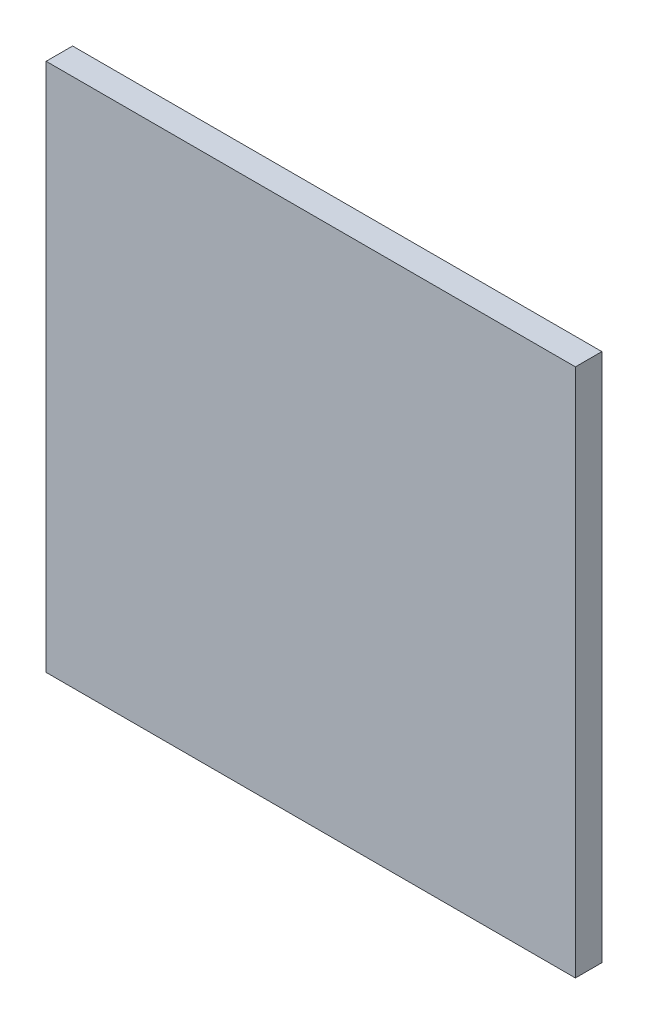
ISO-10303-21;
HEADER;
FILE_DESCRIPTION(('STEP AP214'),'2;1');
FILE_NAME('part.step','',(''),(''),'','','');
FILE_SCHEMA(('AUTOMOTIVE_DESIGN { 1 0 10303 214 1 1 1 1 }'));
ENDSEC;
DATA;
#1=APPLICATION_CONTEXT('core data for automotive mechanical design processes');
#2=APPLICATION_PROTOCOL_DEFINITION('international standard','automotive_design',2000,#1);
#3=PRODUCT_CONTEXT('',#1,'mechanical');
#4=PRODUCT('Part','Part','',(#3));
#5=PRODUCT_RELATED_PRODUCT_CATEGORY('part','',(#4));
#6=PRODUCT_DEFINITION_FORMATION('','',#4);
#7=PRODUCT_DEFINITION_CONTEXT('part definition',#1,'design');
#8=PRODUCT_DEFINITION('design','',#6,#7);
#9=PRODUCT_DEFINITION_SHAPE('','',#8);
#10=(LENGTH_UNIT() NAMED_UNIT(*) SI_UNIT(.MILLI.,.METRE.));
#11=(NAMED_UNIT(*) PLANE_ANGLE_UNIT() SI_UNIT($,.RADIAN.));
#12=(NAMED_UNIT(*) SI_UNIT($,.STERADIAN.) SOLID_ANGLE_UNIT());
#13=UNCERTAINTY_MEASURE_WITH_UNIT(LENGTH_MEASURE(1.E-05),#10,'distance_accuracy_value','');
#14=(GEOMETRIC_REPRESENTATION_CONTEXT(3) GLOBAL_UNCERTAINTY_ASSIGNED_CONTEXT((#13)) GLOBAL_UNIT_ASSIGNED_CONTEXT((#10,
#11,#12)) REPRESENTATION_CONTEXT('',''));
#15=CARTESIAN_POINT('',(0.,0.,0.));
#16=DIRECTION('',(0.,0.,1.));
#17=DIRECTION('',(1.,0.,0.));
#18=AXIS2_PLACEMENT_3D('',#15,#16,#17);
#19=CARTESIAN_POINT('',(0.,0.,3.));
#20=DIRECTION('',(-1.,0.,0.));
#21=DIRECTION('',(0.,0.,1.));
#22=AXIS2_PLACEMENT_3D('',#19,#20,#21);
#23=PLANE('',#22);
#24=DIRECTION('',(0.,1.,0.));
#25=VECTOR('',#24,1.);
#26=CARTESIAN_POINT('',(0.,0.,0.));
#27=LINE('',#26,#25);
#28=CARTESIAN_POINT('',(0.,0.,0.));
#29=VERTEX_POINT('',#28);
#30=CARTESIAN_POINT('',(0.,60.,0.));
#31=VERTEX_POINT('',#30);
#32=EDGE_CURVE('E109',#29,#31,#27,.T.);
#33=ORIENTED_EDGE('',*,*,#32,.T.);
#34=DIRECTION('',(0.,0.,-1.));
#35=VECTOR('',#34,1.);
#36=CARTESIAN_POINT('',(0.,60.,3.));
#37=LINE('',#36,#35);
#38=CARTESIAN_POINT('',(0.,60.,3.));
#39=VERTEX_POINT('',#38);
#40=EDGE_CURVE('E11',#39,#31,#37,.T.);
#41=ORIENTED_EDGE('',*,*,#40,.F.);
#42=DIRECTION('',(0.,1.,0.));
#43=VECTOR('',#42,1.);
#44=CARTESIAN_POINT('',(0.,0.,3.));
#45=LINE('',#44,#43);
#46=CARTESIAN_POINT('',(0.,0.,3.));
#47=VERTEX_POINT('',#46);
#48=EDGE_CURVE('E93',#47,#39,#45,.T.);
#49=ORIENTED_EDGE('',*,*,#48,.F.);
#50=DIRECTION('',(0.,0.,-1.));
#51=VECTOR('',#50,1.);
#52=CARTESIAN_POINT('',(0.,0.,3.));
#53=LINE('',#52,#51);
#54=EDGE_CURVE('E105',#47,#29,#53,.T.);
#55=ORIENTED_EDGE('',*,*,#54,.T.);
#56=EDGE_LOOP('',(#33,#41,#49,#55));
#57=FACE_BOUND('',#56,.T.);
#58=ADVANCED_FACE('F41',(#57),#23,.F.);
#59=CARTESIAN_POINT('',(0.,60.,3.));
#60=DIRECTION('',(0.,-1.,0.));
#61=DIRECTION('',(1.,0.,0.));
#62=AXIS2_PLACEMENT_3D('',#59,#60,#61);
#63=PLANE('',#62);
#64=DIRECTION('',(-1.,0.,0.));
#65=VECTOR('',#64,1.);
#66=CARTESIAN_POINT('',(0.,60.,0.));
#67=LINE('',#66,#65);
#68=CARTESIAN_POINT('',(-60.,60.,0.));
#69=VERTEX_POINT('',#68);
#70=EDGE_CURVE('E98',#31,#69,#67,.T.);
#71=ORIENTED_EDGE('',*,*,#70,.T.);
#72=DIRECTION('',(0.,0.,-1.));
#73=VECTOR('',#72,1.);
#74=CARTESIAN_POINT('',(-60.,60.,3.));
#75=LINE('',#74,#73);
#76=CARTESIAN_POINT('',(-60.,60.,3.));
#77=VERTEX_POINT('',#76);
#78=EDGE_CURVE('E50',#77,#69,#75,.T.);
#79=ORIENTED_EDGE('',*,*,#78,.F.);
#80=DIRECTION('',(-1.,0.,0.));
#81=VECTOR('',#80,1.);
#82=CARTESIAN_POINT('',(0.,60.,3.));
#83=LINE('',#82,#81);
#84=EDGE_CURVE('E88',#39,#77,#83,.T.);
#85=ORIENTED_EDGE('',*,*,#84,.F.);
#86=ORIENTED_EDGE('',*,*,#40,.T.);
#87=EDGE_LOOP('',(#71,#79,#85,#86));
#88=FACE_BOUND('',#87,.T.);
#89=ADVANCED_FACE('F97',(#88),#63,.F.);
#90=CARTESIAN_POINT('',(-60.,0.,3.));
#91=DIRECTION('',(1.,0.,0.));
#92=DIRECTION('',(0.,0.,-1.));
#93=AXIS2_PLACEMENT_3D('',#90,#91,#92);
#94=PLANE('',#93);
#95=DIRECTION('',(0.,-1.,0.));
#96=VECTOR('',#95,1.);
#97=CARTESIAN_POINT('',(-60.,0.,0.));
#98=LINE('',#97,#96);
#99=CARTESIAN_POINT('',(-60.,0.,0.));
#100=VERTEX_POINT('',#99);
#101=EDGE_CURVE('E75',#69,#100,#98,.T.);
#102=ORIENTED_EDGE('',*,*,#101,.T.);
#103=DIRECTION('',(0.,0.,-1.));
#104=VECTOR('',#103,1.);
#105=CARTESIAN_POINT('',(-60.,0.,3.));
#106=LINE('',#105,#104);
#107=CARTESIAN_POINT('',(-60.,0.,3.));
#108=VERTEX_POINT('',#107);
#109=EDGE_CURVE('E100',#108,#100,#106,.T.);
#110=ORIENTED_EDGE('',*,*,#109,.F.);
#111=DIRECTION('',(0.,-1.,0.));
#112=VECTOR('',#111,1.);
#113=CARTESIAN_POINT('',(-60.,0.,3.));
#114=LINE('',#113,#112);
#115=EDGE_CURVE('E91',#77,#108,#114,.T.);
#116=ORIENTED_EDGE('',*,*,#115,.F.);
#117=ORIENTED_EDGE('',*,*,#78,.T.);
#118=EDGE_LOOP('',(#102,#110,#116,#117));
#119=FACE_BOUND('',#118,.T.);
#120=ADVANCED_FACE('F101',(#119),#94,.F.);
#121=CARTESIAN_POINT('',(0.,0.,3.));
#122=DIRECTION('',(0.,1.,0.));
#123=DIRECTION('',(0.,0.,1.));
#124=AXIS2_PLACEMENT_3D('',#121,#122,#123);
#125=PLANE('',#124);
#126=DIRECTION('',(1.,0.,0.));
#127=VECTOR('',#126,1.);
#128=CARTESIAN_POINT('',(0.,0.,0.));
#129=LINE('',#128,#127);
#130=EDGE_CURVE('E81',#100,#29,#129,.T.);
#131=ORIENTED_EDGE('',*,*,#130,.T.);
#132=ORIENTED_EDGE('',*,*,#54,.F.);
#133=DIRECTION('',(1.,0.,0.));
#134=VECTOR('',#133,1.);
#135=CARTESIAN_POINT('',(0.,0.,3.));
#136=LINE('',#135,#134);
#137=EDGE_CURVE('E58',#108,#47,#136,.T.);
#138=ORIENTED_EDGE('',*,*,#137,.F.);
#139=ORIENTED_EDGE('',*,*,#109,.T.);
#140=EDGE_LOOP('',(#131,#132,#138,#139));
#141=FACE_BOUND('',#140,.T.);
#142=ADVANCED_FACE('F122',(#141),#125,.F.);
#143=CARTESIAN_POINT('',(0.,0.,3.));
#144=DIRECTION('',(0.,0.,1.));
#145=DIRECTION('',(1.,0.,0.));
#146=AXIS2_PLACEMENT_3D('',#143,#144,#145);
#147=PLANE('',#146);
#148=ORIENTED_EDGE('',*,*,#48,.T.);
#149=ORIENTED_EDGE('',*,*,#84,.T.);
#150=ORIENTED_EDGE('',*,*,#115,.T.);
#151=ORIENTED_EDGE('',*,*,#137,.T.);
#152=EDGE_LOOP('',(#148,#149,#150,#151));
#153=FACE_BOUND('',#152,.T.);
#154=ADVANCED_FACE('F89',(#153),#147,.T.);
#155=CARTESIAN_POINT('',(0.,0.,0.));
#156=DIRECTION('',(0.,0.,1.));
#157=DIRECTION('',(1.,0.,0.));
#158=AXIS2_PLACEMENT_3D('',#155,#156,#157);
#159=PLANE('',#158);
#160=ORIENTED_EDGE('',*,*,#32,.F.);
#161=ORIENTED_EDGE('',*,*,#130,.F.);
#162=ORIENTED_EDGE('',*,*,#101,.F.);
#163=ORIENTED_EDGE('',*,*,#70,.F.);
#164=EDGE_LOOP('',(#160,#161,#162,#163));
#165=FACE_BOUND('',#164,.T.);
#166=ADVANCED_FACE('F125',(#165),#159,.F.);
#167=CLOSED_SHELL('',(#58,#89,#120,#142,#154,#166));
#168=MANIFOLD_SOLID_BREP('B2',#167);
#169=ADVANCED_BREP_SHAPE_REPRESENTATION('',(#18,#168),#14);
#170=SHAPE_DEFINITION_REPRESENTATION(#9,#169);
ENDSEC;
END-ISO-10303-21;
